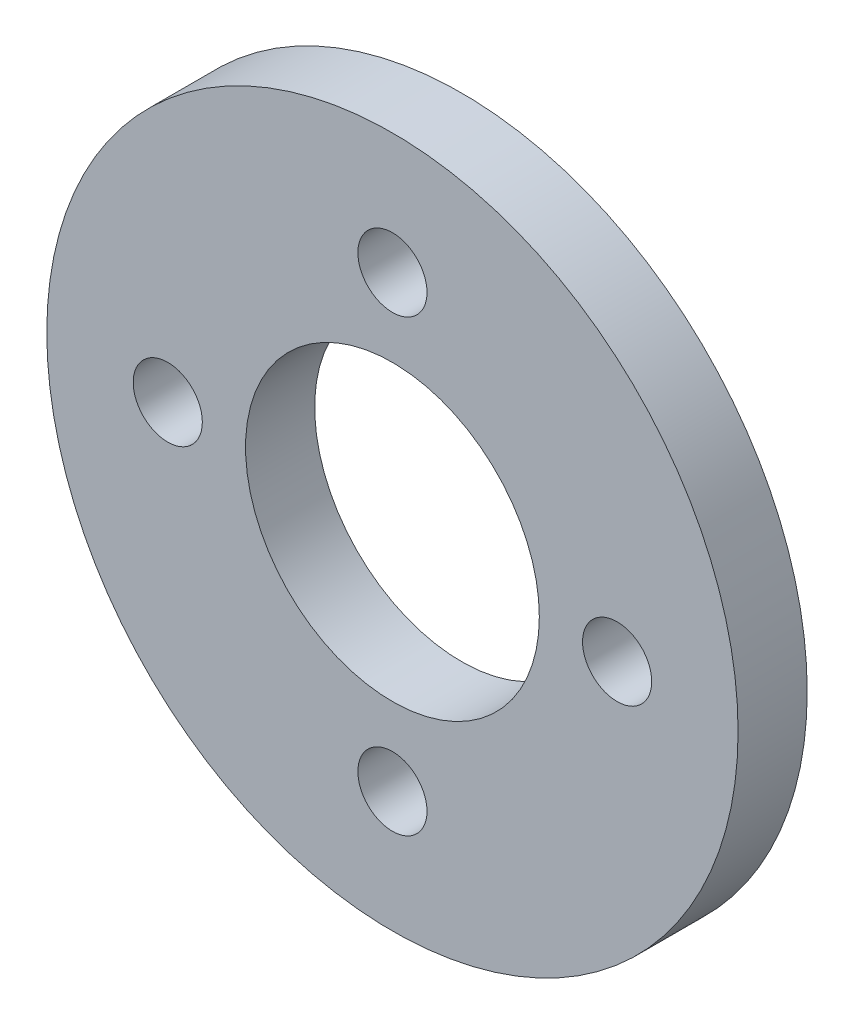
ISO-10303-21;
HEADER;
FILE_DESCRIPTION(('STEP AP214'),'2;1');
FILE_NAME('part.step','',(''),(''),'','','');
FILE_SCHEMA(('AUTOMOTIVE_DESIGN { 1 0 10303 214 1 1 1 1 }'));
ENDSEC;
DATA;
#1=APPLICATION_CONTEXT('core data for automotive mechanical design processes');
#2=APPLICATION_PROTOCOL_DEFINITION('international standard','automotive_design',2000,#1);
#3=PRODUCT_CONTEXT('',#1,'mechanical');
#4=PRODUCT('Part','Part','',(#3));
#5=PRODUCT_RELATED_PRODUCT_CATEGORY('part','',(#4));
#6=PRODUCT_DEFINITION_FORMATION('','',#4);
#7=PRODUCT_DEFINITION_CONTEXT('part definition',#1,'design');
#8=PRODUCT_DEFINITION('design','',#6,#7);
#9=PRODUCT_DEFINITION_SHAPE('','',#8);
#10=(LENGTH_UNIT() NAMED_UNIT(*) SI_UNIT(.MILLI.,.METRE.));
#11=(NAMED_UNIT(*) PLANE_ANGLE_UNIT() SI_UNIT($,.RADIAN.));
#12=(NAMED_UNIT(*) SI_UNIT($,.STERADIAN.) SOLID_ANGLE_UNIT());
#13=UNCERTAINTY_MEASURE_WITH_UNIT(LENGTH_MEASURE(1.E-05),#10,'distance_accuracy_value','');
#14=(GEOMETRIC_REPRESENTATION_CONTEXT(3) GLOBAL_UNCERTAINTY_ASSIGNED_CONTEXT((#13)) GLOBAL_UNIT_ASSIGNED_CONTEXT((#10,
#11,#12)) REPRESENTATION_CONTEXT('',''));
#15=CARTESIAN_POINT('',(0.,0.,0.));
#16=DIRECTION('',(0.,0.,1.));
#17=DIRECTION('',(1.,0.,0.));
#18=AXIS2_PLACEMENT_3D('',#15,#16,#17);
#19=CARTESIAN_POINT('',(0.,0.,2.));
#20=DIRECTION('',(0.,0.,1.));
#21=DIRECTION('',(1.,0.,0.));
#22=AXIS2_PLACEMENT_3D('',#19,#20,#21);
#23=PLANE('',#22);
#24=CARTESIAN_POINT('',(6.5,0.,2.));
#25=DIRECTION('',(0.,0.,1.));
#26=DIRECTION('',(-1.,0.,0.));
#27=AXIS2_PLACEMENT_3D('',#24,#25,#26);
#28=CIRCLE('',#27,1.);
#29=CARTESIAN_POINT('',(5.5,0.,2.));
#30=VERTEX_POINT('',#29);
#31=EDGE_CURVE('E67',#30,#30,#28,.T.);
#32=ORIENTED_EDGE('',*,*,#31,.F.);
#33=EDGE_LOOP('',(#32));
#34=FACE_BOUND('',#33,.T.);
#35=CARTESIAN_POINT('',(0.,6.5,2.));
#36=DIRECTION('',(0.,0.,1.));
#37=DIRECTION('',(0.,-1.,0.));
#38=AXIS2_PLACEMENT_3D('',#35,#36,#37);
#39=CIRCLE('',#38,1.);
#40=CARTESIAN_POINT('',(0.,5.5,2.));
#41=VERTEX_POINT('',#40);
#42=EDGE_CURVE('E68',#41,#41,#39,.T.);
#43=ORIENTED_EDGE('',*,*,#42,.F.);
#44=EDGE_LOOP('',(#43));
#45=FACE_BOUND('',#44,.T.);
#46=CARTESIAN_POINT('',(0.,-6.5,2.));
#47=DIRECTION('',(0.,0.,1.));
#48=DIRECTION('',(0.,1.,0.));
#49=AXIS2_PLACEMENT_3D('',#46,#47,#48);
#50=CIRCLE('',#49,1.);
#51=CARTESIAN_POINT('',(0.,-5.5,2.));
#52=VERTEX_POINT('',#51);
#53=EDGE_CURVE('E60',#52,#52,#50,.T.);
#54=ORIENTED_EDGE('',*,*,#53,.F.);
#55=EDGE_LOOP('',(#54));
#56=FACE_BOUND('',#55,.T.);
#57=CARTESIAN_POINT('',(-6.5,0.,2.));
#58=DIRECTION('',(0.,0.,1.));
#59=DIRECTION('',(1.,0.,0.));
#60=AXIS2_PLACEMENT_3D('',#57,#58,#59);
#61=CIRCLE('',#60,1.);
#62=CARTESIAN_POINT('',(-5.5,0.,2.));
#63=VERTEX_POINT('',#62);
#64=EDGE_CURVE('E54',#63,#63,#61,.T.);
#65=ORIENTED_EDGE('',*,*,#64,.F.);
#66=EDGE_LOOP('',(#65));
#67=FACE_BOUND('',#66,.T.);
#68=CARTESIAN_POINT('',(0.,0.,2.));
#69=DIRECTION('',(0.,0.,1.));
#70=DIRECTION('',(1.,0.,0.));
#71=AXIS2_PLACEMENT_3D('',#68,#69,#70);
#72=CIRCLE('',#71,10.);
#73=CARTESIAN_POINT('',(10.,0.,2.));
#74=VERTEX_POINT('',#73);
#75=EDGE_CURVE('E10',#74,#74,#72,.T.);
#76=ORIENTED_EDGE('',*,*,#75,.T.);
#77=EDGE_LOOP('',(#76));
#78=FACE_BOUND('',#77,.T.);
#79=CARTESIAN_POINT('',(0.,0.,2.));
#80=DIRECTION('',(0.,0.,1.));
#81=DIRECTION('',(1.,0.,0.));
#82=AXIS2_PLACEMENT_3D('',#79,#80,#81);
#83=CIRCLE('',#82,4.25);
#84=CARTESIAN_POINT('',(4.25,0.,2.));
#85=VERTEX_POINT('',#84);
#86=EDGE_CURVE('E44',#85,#85,#83,.T.);
#87=ORIENTED_EDGE('',*,*,#86,.F.);
#88=EDGE_LOOP('',(#87));
#89=FACE_BOUND('',#88,.T.);
#90=ADVANCED_FACE('F33',(#34,#45,#56,#67,#78,#89),#23,.T.);
#91=CARTESIAN_POINT('',(0.,0.,0.));
#92=DIRECTION('',(0.,0.,1.));
#93=DIRECTION('',(1.,0.,0.));
#94=AXIS2_PLACEMENT_3D('',#91,#92,#93);
#95=PLANE('',#94);
#96=CARTESIAN_POINT('',(6.5,0.,0.));
#97=DIRECTION('',(0.,0.,1.));
#98=DIRECTION('',(1.,0.,0.));
#99=AXIS2_PLACEMENT_3D('',#96,#97,#98);
#100=CIRCLE('',#99,1.);
#101=CARTESIAN_POINT('',(7.5,0.,0.));
#102=VERTEX_POINT('',#101);
#103=EDGE_CURVE('E63',#102,#102,#100,.F.);
#104=ORIENTED_EDGE('',*,*,#103,.F.);
#105=EDGE_LOOP('',(#104));
#106=FACE_BOUND('',#105,.T.);
#107=CARTESIAN_POINT('',(0.,6.5,0.));
#108=DIRECTION('',(0.,0.,1.));
#109=DIRECTION('',(1.,0.,0.));
#110=AXIS2_PLACEMENT_3D('',#107,#108,#109);
#111=CIRCLE('',#110,1.);
#112=CARTESIAN_POINT('',(0.999999999999932,6.5,0.));
#113=VERTEX_POINT('',#112);
#114=EDGE_CURVE('E64',#113,#113,#111,.F.);
#115=ORIENTED_EDGE('',*,*,#114,.F.);
#116=EDGE_LOOP('',(#115));
#117=FACE_BOUND('',#116,.T.);
#118=CARTESIAN_POINT('',(0.,-6.5,0.));
#119=DIRECTION('',(0.,0.,1.));
#120=DIRECTION('',(1.,0.,0.));
#121=AXIS2_PLACEMENT_3D('',#118,#119,#120);
#122=CIRCLE('',#121,1.);
#123=CARTESIAN_POINT('',(1.00000000000002,-6.5,0.));
#124=VERTEX_POINT('',#123);
#125=EDGE_CURVE('E57',#124,#124,#122,.F.);
#126=ORIENTED_EDGE('',*,*,#125,.F.);
#127=EDGE_LOOP('',(#126));
#128=FACE_BOUND('',#127,.T.);
#129=CARTESIAN_POINT('',(-6.5,0.,0.));
#130=DIRECTION('',(0.,0.,1.));
#131=DIRECTION('',(1.,0.,0.));
#132=AXIS2_PLACEMENT_3D('',#129,#130,#131);
#133=CIRCLE('',#132,1.);
#134=CARTESIAN_POINT('',(-5.5,0.,0.));
#135=VERTEX_POINT('',#134);
#136=EDGE_CURVE('E49',#135,#135,#133,.F.);
#137=ORIENTED_EDGE('',*,*,#136,.F.);
#138=EDGE_LOOP('',(#137));
#139=FACE_BOUND('',#138,.T.);
#140=CARTESIAN_POINT('',(0.,0.,0.));
#141=DIRECTION('',(0.,0.,1.));
#142=DIRECTION('',(1.,0.,0.));
#143=AXIS2_PLACEMENT_3D('',#140,#141,#142);
#144=CIRCLE('',#143,10.);
#145=CARTESIAN_POINT('',(10.,0.,0.));
#146=VERTEX_POINT('',#145);
#147=EDGE_CURVE('E37',#146,#146,#144,.T.);
#148=ORIENTED_EDGE('',*,*,#147,.F.);
#149=EDGE_LOOP('',(#148));
#150=FACE_BOUND('',#149,.T.);
#151=CARTESIAN_POINT('',(0.,0.,0.));
#152=DIRECTION('',(0.,0.,1.));
#153=DIRECTION('',(1.,0.,0.));
#154=AXIS2_PLACEMENT_3D('',#151,#152,#153);
#155=CIRCLE('',#154,4.25);
#156=CARTESIAN_POINT('',(4.25,0.,0.));
#157=VERTEX_POINT('',#156);
#158=EDGE_CURVE('E46',#157,#157,#155,.T.);
#159=ORIENTED_EDGE('',*,*,#158,.T.);
#160=EDGE_LOOP('',(#159));
#161=FACE_BOUND('',#160,.T.);
#162=ADVANCED_FACE('F80',(#106,#117,#128,#139,#150,#161),#95,.F.);
#163=CARTESIAN_POINT('',(0.,0.,2.));
#164=DIRECTION('',(0.,0.,-1.));
#165=DIRECTION('',(-1.,0.,0.));
#166=AXIS2_PLACEMENT_3D('',#163,#164,#165);
#167=CYLINDRICAL_SURFACE('',#166,10.);
#168=ORIENTED_EDGE('',*,*,#75,.F.);
#169=EDGE_LOOP('',(#168));
#170=FACE_BOUND('',#169,.T.);
#171=ORIENTED_EDGE('',*,*,#147,.T.);
#172=EDGE_LOOP('',(#171));
#173=FACE_BOUND('',#172,.T.);
#174=ADVANCED_FACE('F35',(#170,#173),#167,.T.);
#175=CARTESIAN_POINT('',(0.,0.,2.));
#176=DIRECTION('',(0.,0.,-1.));
#177=DIRECTION('',(-1.,0.,0.));
#178=AXIS2_PLACEMENT_3D('',#175,#176,#177);
#179=CYLINDRICAL_SURFACE('',#178,4.25);
#180=ORIENTED_EDGE('',*,*,#86,.T.);
#181=EDGE_LOOP('',(#180));
#182=FACE_BOUND('',#181,.T.);
#183=ORIENTED_EDGE('',*,*,#158,.F.);
#184=EDGE_LOOP('',(#183));
#185=FACE_BOUND('',#184,.T.);
#186=ADVANCED_FACE('F90',(#182,#185),#179,.F.);
#187=CARTESIAN_POINT('',(-6.5,0.,-2.82842712474619));
#188=DIRECTION('',(0.,0.,1.));
#189=DIRECTION('',(1.,0.,0.));
#190=AXIS2_PLACEMENT_3D('',#187,#188,#189);
#191=CYLINDRICAL_SURFACE('',#190,1.);
#192=ORIENTED_EDGE('',*,*,#136,.T.);
#193=EDGE_LOOP('',(#192));
#194=FACE_BOUND('',#193,.T.);
#195=ORIENTED_EDGE('',*,*,#64,.T.);
#196=EDGE_LOOP('',(#195));
#197=FACE_BOUND('',#196,.T.);
#198=ADVANCED_FACE('F93',(#194,#197),#191,.F.);
#199=CARTESIAN_POINT('',(0.,-6.5,-2.82842712474619));
#200=DIRECTION('',(0.,0.,1.));
#201=DIRECTION('',(1.,0.,0.));
#202=AXIS2_PLACEMENT_3D('',#199,#200,#201);
#203=CYLINDRICAL_SURFACE('',#202,1.);
#204=ORIENTED_EDGE('',*,*,#125,.T.);
#205=EDGE_LOOP('',(#204));
#206=FACE_BOUND('',#205,.T.);
#207=ORIENTED_EDGE('',*,*,#53,.T.);
#208=EDGE_LOOP('',(#207));
#209=FACE_BOUND('',#208,.T.);
#210=ADVANCED_FACE('F108',(#206,#209),#203,.F.);
#211=CARTESIAN_POINT('',(0.,6.5,-2.82842712474619));
#212=DIRECTION('',(0.,0.,1.));
#213=DIRECTION('',(1.,0.,0.));
#214=AXIS2_PLACEMENT_3D('',#211,#212,#213);
#215=CYLINDRICAL_SURFACE('',#214,1.);
#216=ORIENTED_EDGE('',*,*,#114,.T.);
#217=EDGE_LOOP('',(#216));
#218=FACE_BOUND('',#217,.T.);
#219=ORIENTED_EDGE('',*,*,#42,.T.);
#220=EDGE_LOOP('',(#219));
#221=FACE_BOUND('',#220,.T.);
#222=ADVANCED_FACE('F112',(#218,#221),#215,.F.);
#223=CARTESIAN_POINT('',(6.5,0.,-2.82842712474619));
#224=DIRECTION('',(0.,0.,1.));
#225=DIRECTION('',(1.,0.,0.));
#226=AXIS2_PLACEMENT_3D('',#223,#224,#225);
#227=CYLINDRICAL_SURFACE('',#226,1.);
#228=ORIENTED_EDGE('',*,*,#103,.T.);
#229=EDGE_LOOP('',(#228));
#230=FACE_BOUND('',#229,.T.);
#231=ORIENTED_EDGE('',*,*,#31,.T.);
#232=EDGE_LOOP('',(#231));
#233=FACE_BOUND('',#232,.T.);
#234=ADVANCED_FACE('F76',(#230,#233),#227,.F.);
#235=CLOSED_SHELL('',(#90,#162,#174,#186,#198,#210,#222,#234));
#236=MANIFOLD_SOLID_BREP('B2',#235);
#237=ADVANCED_BREP_SHAPE_REPRESENTATION('',(#18,#236),#14);
#238=SHAPE_DEFINITION_REPRESENTATION(#9,#237);
ENDSEC;
END-ISO-10303-21;
